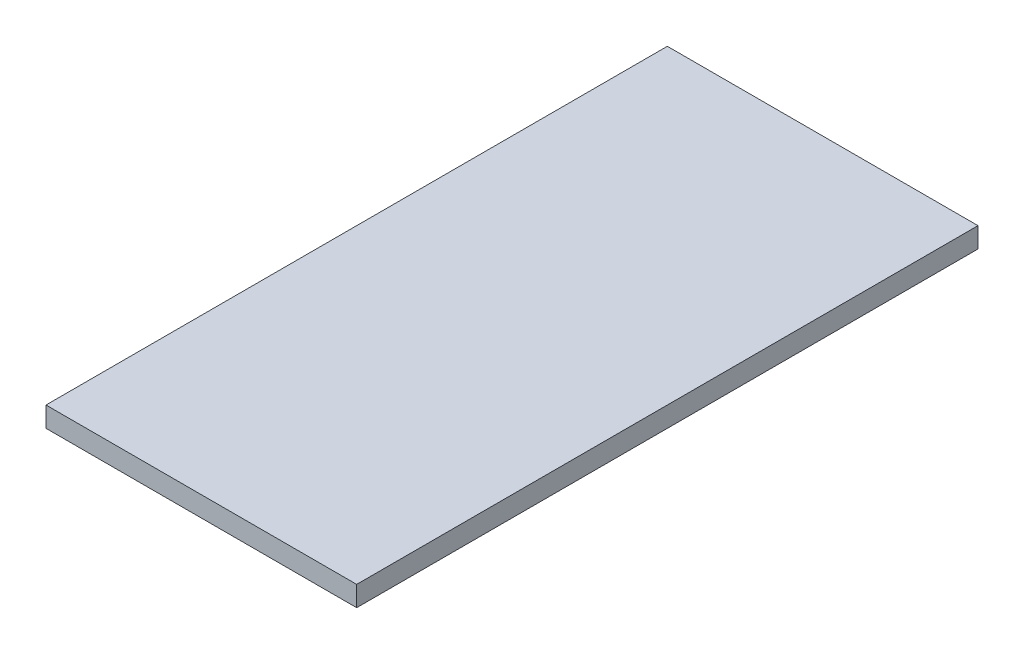
ISO-10303-21;
HEADER;
FILE_DESCRIPTION(('STEP AP214'),'2;1');
FILE_NAME('part.step','',(''),(''),'','','');
FILE_SCHEMA(('AUTOMOTIVE_DESIGN { 1 0 10303 214 1 1 1 1 }'));
ENDSEC;
DATA;
#1=APPLICATION_CONTEXT('core data for automotive mechanical design processes');
#2=APPLICATION_PROTOCOL_DEFINITION('international standard','automotive_design',2000,#1);
#3=PRODUCT_CONTEXT('',#1,'mechanical');
#4=PRODUCT('Part','Part','',(#3));
#5=PRODUCT_RELATED_PRODUCT_CATEGORY('part','',(#4));
#6=PRODUCT_DEFINITION_FORMATION('','',#4);
#7=PRODUCT_DEFINITION_CONTEXT('part definition',#1,'design');
#8=PRODUCT_DEFINITION('design','',#6,#7);
#9=PRODUCT_DEFINITION_SHAPE('','',#8);
#10=(LENGTH_UNIT() NAMED_UNIT(*) SI_UNIT(.MILLI.,.METRE.));
#11=(NAMED_UNIT(*) PLANE_ANGLE_UNIT() SI_UNIT($,.RADIAN.));
#12=(NAMED_UNIT(*) SI_UNIT($,.STERADIAN.) SOLID_ANGLE_UNIT());
#13=UNCERTAINTY_MEASURE_WITH_UNIT(LENGTH_MEASURE(1.E-05),#10,'distance_accuracy_value','');
#14=(GEOMETRIC_REPRESENTATION_CONTEXT(3) GLOBAL_UNCERTAINTY_ASSIGNED_CONTEXT((#13)) GLOBAL_UNIT_ASSIGNED_CONTEXT((#10,
#11,#12)) REPRESENTATION_CONTEXT('',''));
#15=CARTESIAN_POINT('',(0.,0.,0.));
#16=DIRECTION('',(0.,0.,1.));
#17=DIRECTION('',(1.,0.,0.));
#18=AXIS2_PLACEMENT_3D('',#15,#16,#17);
#19=CARTESIAN_POINT('',(0.,19.84375,0.));
#20=DIRECTION('',(1.,0.,0.));
#21=DIRECTION('',(0.,0.,-1.));
#22=AXIS2_PLACEMENT_3D('',#19,#20,#21);
#23=PLANE('',#22);
#24=DIRECTION('',(0.,0.,1.));
#25=VECTOR('',#24,1.);
#26=CARTESIAN_POINT('',(0.,0.,0.));
#27=LINE('',#26,#25);
#28=CARTESIAN_POINT('',(0.,0.,-609.6));
#29=VERTEX_POINT('',#28);
#30=CARTESIAN_POINT('',(0.,0.,0.));
#31=VERTEX_POINT('',#30);
#32=EDGE_CURVE('E102',#29,#31,#27,.T.);
#33=ORIENTED_EDGE('',*,*,#32,.T.);
#34=DIRECTION('',(0.,-1.,0.));
#35=VECTOR('',#34,1.);
#36=CARTESIAN_POINT('',(0.,19.84375,0.));
#37=LINE('',#36,#35);
#38=CARTESIAN_POINT('',(0.,19.84375,0.));
#39=VERTEX_POINT('',#38);
#40=EDGE_CURVE('E11',#39,#31,#37,.T.);
#41=ORIENTED_EDGE('',*,*,#40,.F.);
#42=DIRECTION('',(0.,0.,1.));
#43=VECTOR('',#42,1.);
#44=CARTESIAN_POINT('',(0.,19.84375,0.));
#45=LINE('',#44,#43);
#46=CARTESIAN_POINT('',(0.,19.84375,-609.6));
#47=VERTEX_POINT('',#46);
#48=EDGE_CURVE('E90',#47,#39,#45,.T.);
#49=ORIENTED_EDGE('',*,*,#48,.F.);
#50=DIRECTION('',(0.,-1.,0.));
#51=VECTOR('',#50,1.);
#52=CARTESIAN_POINT('',(0.,19.84375,-609.6));
#53=LINE('',#52,#51);
#54=EDGE_CURVE('E98',#47,#29,#53,.T.);
#55=ORIENTED_EDGE('',*,*,#54,.T.);
#56=EDGE_LOOP('',(#33,#41,#49,#55));
#57=FACE_BOUND('',#56,.T.);
#58=ADVANCED_FACE('F39',(#57),#23,.F.);
#59=CARTESIAN_POINT('',(0.,19.84375,0.));
#60=DIRECTION('',(0.,0.,-1.));
#61=DIRECTION('',(-1.,0.,0.));
#62=AXIS2_PLACEMENT_3D('',#59,#60,#61);
#63=PLANE('',#62);
#64=DIRECTION('',(1.,0.,0.));
#65=VECTOR('',#64,1.);
#66=CARTESIAN_POINT('',(0.,0.,0.));
#67=LINE('',#66,#65);
#68=CARTESIAN_POINT('',(304.8,0.,0.));
#69=VERTEX_POINT('',#68);
#70=EDGE_CURVE('E94',#31,#69,#67,.T.);
#71=ORIENTED_EDGE('',*,*,#70,.T.);
#72=DIRECTION('',(0.,-1.,0.));
#73=VECTOR('',#72,1.);
#74=CARTESIAN_POINT('',(304.8,19.84375,0.));
#75=LINE('',#74,#73);
#76=CARTESIAN_POINT('',(304.8,19.84375,0.));
#77=VERTEX_POINT('',#76);
#78=EDGE_CURVE('E47',#77,#69,#75,.T.);
#79=ORIENTED_EDGE('',*,*,#78,.F.);
#80=DIRECTION('',(1.,0.,0.));
#81=VECTOR('',#80,1.);
#82=CARTESIAN_POINT('',(0.,19.84375,0.));
#83=LINE('',#82,#81);
#84=EDGE_CURVE('E85',#39,#77,#83,.T.);
#85=ORIENTED_EDGE('',*,*,#84,.F.);
#86=ORIENTED_EDGE('',*,*,#40,.T.);
#87=EDGE_LOOP('',(#71,#79,#85,#86));
#88=FACE_BOUND('',#87,.T.);
#89=ADVANCED_FACE('F93',(#88),#63,.F.);
#90=CARTESIAN_POINT('',(304.8,19.84375,0.));
#91=DIRECTION('',(-1.,0.,0.));
#92=DIRECTION('',(0.,0.,1.));
#93=AXIS2_PLACEMENT_3D('',#90,#91,#92);
#94=PLANE('',#93);
#95=DIRECTION('',(0.,0.,-1.));
#96=VECTOR('',#95,1.);
#97=CARTESIAN_POINT('',(304.8,0.,0.));
#98=LINE('',#97,#96);
#99=CARTESIAN_POINT('',(304.8,0.,-609.6));
#100=VERTEX_POINT('',#99);
#101=EDGE_CURVE('E72',#69,#100,#98,.T.);
#102=ORIENTED_EDGE('',*,*,#101,.T.);
#103=DIRECTION('',(0.,-1.,0.));
#104=VECTOR('',#103,1.);
#105=CARTESIAN_POINT('',(304.8,19.84375,-609.6));
#106=LINE('',#105,#104);
#107=CARTESIAN_POINT('',(304.8,19.84375,-609.6));
#108=VERTEX_POINT('',#107);
#109=EDGE_CURVE('E95',#108,#100,#106,.T.);
#110=ORIENTED_EDGE('',*,*,#109,.F.);
#111=DIRECTION('',(0.,0.,-1.));
#112=VECTOR('',#111,1.);
#113=CARTESIAN_POINT('',(304.8,19.84375,0.));
#114=LINE('',#113,#112);
#115=EDGE_CURVE('E88',#77,#108,#114,.T.);
#116=ORIENTED_EDGE('',*,*,#115,.F.);
#117=ORIENTED_EDGE('',*,*,#78,.T.);
#118=EDGE_LOOP('',(#102,#110,#116,#117));
#119=FACE_BOUND('',#118,.T.);
#120=ADVANCED_FACE('F96',(#119),#94,.F.);
#121=CARTESIAN_POINT('',(0.,19.84375,-609.6));
#122=DIRECTION('',(0.,0.,1.));
#123=DIRECTION('',(1.,0.,0.));
#124=AXIS2_PLACEMENT_3D('',#121,#122,#123);
#125=PLANE('',#124);
#126=DIRECTION('',(-1.,0.,0.));
#127=VECTOR('',#126,1.);
#128=CARTESIAN_POINT('',(0.,0.,-609.6));
#129=LINE('',#128,#127);
#130=EDGE_CURVE('E78',#100,#29,#129,.T.);
#131=ORIENTED_EDGE('',*,*,#130,.T.);
#132=ORIENTED_EDGE('',*,*,#54,.F.);
#133=DIRECTION('',(-1.,0.,0.));
#134=VECTOR('',#133,1.);
#135=CARTESIAN_POINT('',(0.,19.84375,-609.6));
#136=LINE('',#135,#134);
#137=EDGE_CURVE('E55',#108,#47,#136,.T.);
#138=ORIENTED_EDGE('',*,*,#137,.F.);
#139=ORIENTED_EDGE('',*,*,#109,.T.);
#140=EDGE_LOOP('',(#131,#132,#138,#139));
#141=FACE_BOUND('',#140,.T.);
#142=ADVANCED_FACE('F109',(#141),#125,.F.);
#143=CARTESIAN_POINT('',(0.,19.84375,0.));
#144=DIRECTION('',(0.,-1.,0.));
#145=DIRECTION('',(0.,0.,-1.));
#146=AXIS2_PLACEMENT_3D('',#143,#144,#145);
#147=PLANE('',#146);
#148=ORIENTED_EDGE('',*,*,#48,.T.);
#149=ORIENTED_EDGE('',*,*,#84,.T.);
#150=ORIENTED_EDGE('',*,*,#115,.T.);
#151=ORIENTED_EDGE('',*,*,#137,.T.);
#152=EDGE_LOOP('',(#148,#149,#150,#151));
#153=FACE_BOUND('',#152,.T.);
#154=ADVANCED_FACE('F86',(#153),#147,.F.);
#155=CARTESIAN_POINT('',(0.,0.,0.));
#156=DIRECTION('',(0.,-1.,0.));
#157=DIRECTION('',(0.,0.,-1.));
#158=AXIS2_PLACEMENT_3D('',#155,#156,#157);
#159=PLANE('',#158);
#160=ORIENTED_EDGE('',*,*,#32,.F.);
#161=ORIENTED_EDGE('',*,*,#130,.F.);
#162=ORIENTED_EDGE('',*,*,#101,.F.);
#163=ORIENTED_EDGE('',*,*,#70,.F.);
#164=EDGE_LOOP('',(#160,#161,#162,#163));
#165=FACE_BOUND('',#164,.T.);
#166=ADVANCED_FACE('F112',(#165),#159,.T.);
#167=CLOSED_SHELL('',(#58,#89,#120,#142,#154,#166));
#168=MANIFOLD_SOLID_BREP('B2',#167);
#169=ADVANCED_BREP_SHAPE_REPRESENTATION('',(#18,#168),#14);
#170=SHAPE_DEFINITION_REPRESENTATION(#9,#169);
ENDSEC;
END-ISO-10303-21;
